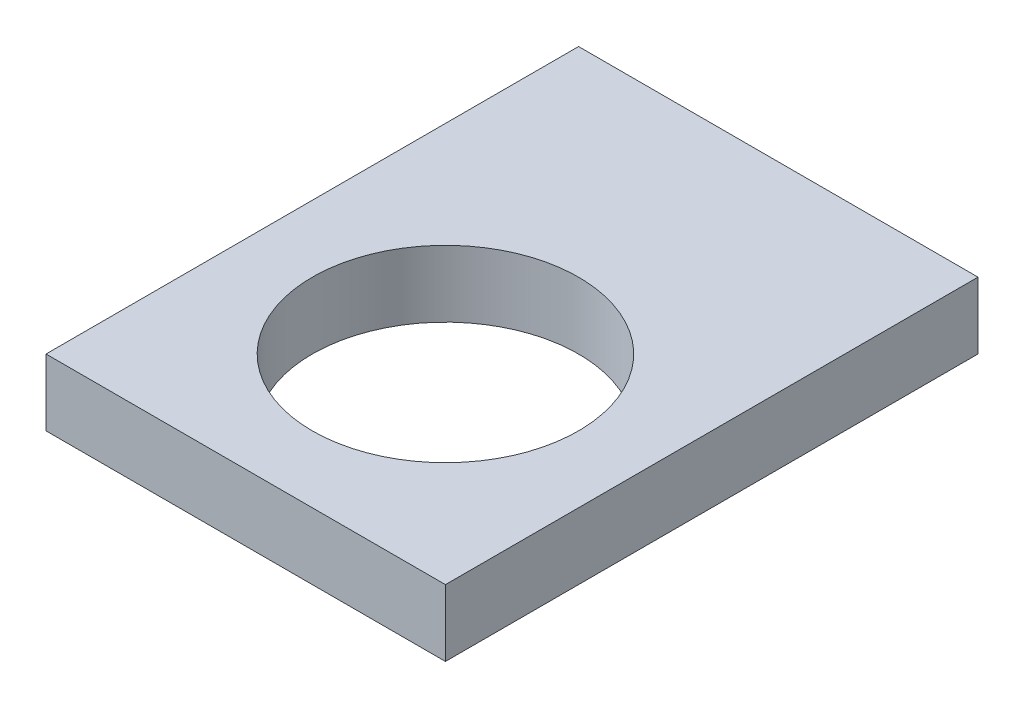
ISO-10303-21;
HEADER;
FILE_DESCRIPTION(('STEP AP214'),'2;1');
FILE_NAME('part.step','',(''),(''),'','','');
FILE_SCHEMA(('AUTOMOTIVE_DESIGN { 1 0 10303 214 1 1 1 1 }'));
ENDSEC;
DATA;
#1=APPLICATION_CONTEXT('core data for automotive mechanical design processes');
#2=APPLICATION_PROTOCOL_DEFINITION('international standard','automotive_design',2000,#1);
#3=PRODUCT_CONTEXT('',#1,'mechanical');
#4=PRODUCT('Part','Part','',(#3));
#5=PRODUCT_RELATED_PRODUCT_CATEGORY('part','',(#4));
#6=PRODUCT_DEFINITION_FORMATION('','',#4);
#7=PRODUCT_DEFINITION_CONTEXT('part definition',#1,'design');
#8=PRODUCT_DEFINITION('design','',#6,#7);
#9=PRODUCT_DEFINITION_SHAPE('','',#8);
#10=(LENGTH_UNIT() NAMED_UNIT(*) SI_UNIT(.MILLI.,.METRE.));
#11=(NAMED_UNIT(*) PLANE_ANGLE_UNIT() SI_UNIT($,.RADIAN.));
#12=(NAMED_UNIT(*) SI_UNIT($,.STERADIAN.) SOLID_ANGLE_UNIT());
#13=UNCERTAINTY_MEASURE_WITH_UNIT(LENGTH_MEASURE(1.E-05),#10,'distance_accuracy_value','');
#14=(GEOMETRIC_REPRESENTATION_CONTEXT(3) GLOBAL_UNCERTAINTY_ASSIGNED_CONTEXT((#13)) GLOBAL_UNIT_ASSIGNED_CONTEXT((#10,
#11,#12)) REPRESENTATION_CONTEXT('',''));
#15=CARTESIAN_POINT('',(0.,0.,0.));
#16=DIRECTION('',(0.,0.,1.));
#17=DIRECTION('',(1.,0.,0.));
#18=AXIS2_PLACEMENT_3D('',#15,#16,#17);
#19=CARTESIAN_POINT('',(0.,5.,20.));
#20=DIRECTION('',(0.,0.,-1.));
#21=DIRECTION('',(-1.,0.,0.));
#22=AXIS2_PLACEMENT_3D('',#19,#20,#21);
#23=PLANE('',#22);
#24=DIRECTION('',(1.,0.,0.));
#25=VECTOR('',#24,1.);
#26=CARTESIAN_POINT('',(0.,0.,20.));
#27=LINE('',#26,#25);
#28=CARTESIAN_POINT('',(-15.,0.,20.));
#29=VERTEX_POINT('',#28);
#30=CARTESIAN_POINT('',(15.,0.,20.));
#31=VERTEX_POINT('',#30);
#32=EDGE_CURVE('E98',#29,#31,#27,.T.);
#33=ORIENTED_EDGE('',*,*,#32,.T.);
#34=DIRECTION('',(0.,-1.,0.));
#35=VECTOR('',#34,1.);
#36=CARTESIAN_POINT('',(15.,5.,20.));
#37=LINE('',#36,#35);
#38=CARTESIAN_POINT('',(15.,5.,20.));
#39=VERTEX_POINT('',#38);
#40=EDGE_CURVE('E11',#39,#31,#37,.T.);
#41=ORIENTED_EDGE('',*,*,#40,.F.);
#42=DIRECTION('',(1.,0.,0.));
#43=VECTOR('',#42,1.);
#44=CARTESIAN_POINT('',(0.,5.,20.));
#45=LINE('',#44,#43);
#46=CARTESIAN_POINT('',(-15.,5.,20.));
#47=VERTEX_POINT('',#46);
#48=EDGE_CURVE('E84',#47,#39,#45,.T.);
#49=ORIENTED_EDGE('',*,*,#48,.F.);
#50=DIRECTION('',(0.,-1.,0.));
#51=VECTOR('',#50,1.);
#52=CARTESIAN_POINT('',(-15.,5.,20.));
#53=LINE('',#52,#51);
#54=EDGE_CURVE('E51',#47,#29,#53,.T.);
#55=ORIENTED_EDGE('',*,*,#54,.T.);
#56=EDGE_LOOP('',(#33,#41,#49,#55));
#57=FACE_BOUND('',#56,.T.);
#58=ADVANCED_FACE('F35',(#57),#23,.F.);
#59=CARTESIAN_POINT('',(15.,5.,0.));
#60=DIRECTION('',(-1.,0.,0.));
#61=DIRECTION('',(0.,0.,1.));
#62=AXIS2_PLACEMENT_3D('',#59,#60,#61);
#63=PLANE('',#62);
#64=DIRECTION('',(0.,0.,-1.));
#65=VECTOR('',#64,1.);
#66=CARTESIAN_POINT('',(15.,0.,0.));
#67=LINE('',#66,#65);
#68=CARTESIAN_POINT('',(15.,0.,-20.));
#69=VERTEX_POINT('',#68);
#70=EDGE_CURVE('E89',#31,#69,#67,.T.);
#71=ORIENTED_EDGE('',*,*,#70,.T.);
#72=DIRECTION('',(0.,-1.,0.));
#73=VECTOR('',#72,1.);
#74=CARTESIAN_POINT('',(15.,5.,-20.));
#75=LINE('',#74,#73);
#76=CARTESIAN_POINT('',(15.,5.,-20.));
#77=VERTEX_POINT('',#76);
#78=EDGE_CURVE('E43',#77,#69,#75,.T.);
#79=ORIENTED_EDGE('',*,*,#78,.F.);
#80=DIRECTION('',(0.,0.,-1.));
#81=VECTOR('',#80,1.);
#82=CARTESIAN_POINT('',(15.,5.,0.));
#83=LINE('',#82,#81);
#84=EDGE_CURVE('E76',#39,#77,#83,.T.);
#85=ORIENTED_EDGE('',*,*,#84,.F.);
#86=ORIENTED_EDGE('',*,*,#40,.T.);
#87=EDGE_LOOP('',(#71,#79,#85,#86));
#88=FACE_BOUND('',#87,.T.);
#89=ADVANCED_FACE('F88',(#88),#63,.F.);
#90=CARTESIAN_POINT('',(0.,5.,-20.));
#91=DIRECTION('',(0.,0.,-1.));
#92=DIRECTION('',(-1.,0.,0.));
#93=AXIS2_PLACEMENT_3D('',#90,#91,#92);
#94=PLANE('',#93);
#95=DIRECTION('',(1.,0.,0.));
#96=VECTOR('',#95,1.);
#97=CARTESIAN_POINT('',(0.,0.,-20.));
#98=LINE('',#97,#96);
#99=CARTESIAN_POINT('',(-15.,0.,-20.));
#100=VERTEX_POINT('',#99);
#101=EDGE_CURVE('E102',#100,#69,#98,.T.);
#102=ORIENTED_EDGE('',*,*,#101,.F.);
#103=DIRECTION('',(0.,-1.,0.));
#104=VECTOR('',#103,1.);
#105=CARTESIAN_POINT('',(-15.,5.,-20.));
#106=LINE('',#105,#104);
#107=CARTESIAN_POINT('',(-15.,5.,-20.));
#108=VERTEX_POINT('',#107);
#109=EDGE_CURVE('E65',#108,#100,#106,.T.);
#110=ORIENTED_EDGE('',*,*,#109,.F.);
#111=DIRECTION('',(1.,0.,0.));
#112=VECTOR('',#111,1.);
#113=CARTESIAN_POINT('',(0.,5.,-20.));
#114=LINE('',#113,#112);
#115=EDGE_CURVE('E83',#108,#77,#114,.T.);
#116=ORIENTED_EDGE('',*,*,#115,.T.);
#117=ORIENTED_EDGE('',*,*,#78,.T.);
#118=EDGE_LOOP('',(#102,#110,#116,#117));
#119=FACE_BOUND('',#118,.T.);
#120=ADVANCED_FACE('F92',(#119),#94,.T.);
#121=CARTESIAN_POINT('',(-15.,5.,0.));
#122=DIRECTION('',(-1.,0.,0.));
#123=DIRECTION('',(0.,0.,1.));
#124=AXIS2_PLACEMENT_3D('',#121,#122,#123);
#125=PLANE('',#124);
#126=DIRECTION('',(0.,0.,-1.));
#127=VECTOR('',#126,1.);
#128=CARTESIAN_POINT('',(-15.,0.,0.));
#129=LINE('',#128,#127);
#130=EDGE_CURVE('E104',#29,#100,#129,.T.);
#131=ORIENTED_EDGE('',*,*,#130,.F.);
#132=ORIENTED_EDGE('',*,*,#54,.F.);
#133=DIRECTION('',(0.,0.,-1.));
#134=VECTOR('',#133,1.);
#135=CARTESIAN_POINT('',(-15.,5.,0.));
#136=LINE('',#135,#134);
#137=EDGE_CURVE('E93',#47,#108,#136,.T.);
#138=ORIENTED_EDGE('',*,*,#137,.T.);
#139=ORIENTED_EDGE('',*,*,#109,.T.);
#140=EDGE_LOOP('',(#131,#132,#138,#139));
#141=FACE_BOUND('',#140,.T.);
#142=ADVANCED_FACE('F125',(#141),#125,.T.);
#143=CARTESIAN_POINT('',(0.,5.,0.));
#144=DIRECTION('',(0.,1.,0.));
#145=DIRECTION('',(0.,0.,1.));
#146=AXIS2_PLACEMENT_3D('',#143,#144,#145);
#147=PLANE('',#146);
#148=CARTESIAN_POINT('',(0.,5.,5.));
#149=DIRECTION('',(0.,1.,0.));
#150=DIRECTION('',(0.,0.,1.));
#151=AXIS2_PLACEMENT_3D('',#148,#149,#150);
#152=CIRCLE('',#151,10.);
#153=CARTESIAN_POINT('',(0.,5.,15.));
#154=VERTEX_POINT('',#153);
#155=EDGE_CURVE('E110',#154,#154,#152,.T.);
#156=ORIENTED_EDGE('',*,*,#155,.F.);
#157=EDGE_LOOP('',(#156));
#158=FACE_BOUND('',#157,.T.);
#159=ORIENTED_EDGE('',*,*,#48,.T.);
#160=ORIENTED_EDGE('',*,*,#84,.T.);
#161=ORIENTED_EDGE('',*,*,#115,.F.);
#162=ORIENTED_EDGE('',*,*,#137,.F.);
#163=EDGE_LOOP('',(#159,#160,#161,#162));
#164=FACE_BOUND('',#163,.T.);
#165=ADVANCED_FACE('F80',(#158,#164),#147,.T.);
#166=CARTESIAN_POINT('',(0.,0.,0.));
#167=DIRECTION('',(0.,1.,0.));
#168=DIRECTION('',(0.,0.,1.));
#169=AXIS2_PLACEMENT_3D('',#166,#167,#168);
#170=PLANE('',#169);
#171=CARTESIAN_POINT('',(0.,0.,5.));
#172=DIRECTION('',(0.,1.,0.));
#173=DIRECTION('',(0.,0.,1.));
#174=AXIS2_PLACEMENT_3D('',#171,#172,#173);
#175=CIRCLE('',#174,10.);
#176=CARTESIAN_POINT('',(0.,0.,15.));
#177=VERTEX_POINT('',#176);
#178=EDGE_CURVE('E100',#177,#177,#175,.T.);
#179=ORIENTED_EDGE('',*,*,#178,.T.);
#180=EDGE_LOOP('',(#179));
#181=FACE_BOUND('',#180,.T.);
#182=ORIENTED_EDGE('',*,*,#32,.F.);
#183=ORIENTED_EDGE('',*,*,#130,.T.);
#184=ORIENTED_EDGE('',*,*,#101,.T.);
#185=ORIENTED_EDGE('',*,*,#70,.F.);
#186=EDGE_LOOP('',(#182,#183,#184,#185));
#187=FACE_BOUND('',#186,.T.);
#188=ADVANCED_FACE('F116',(#181,#187),#170,.F.);
#189=CARTESIAN_POINT('',(0.,0.,5.));
#190=DIRECTION('',(0.,1.,0.));
#191=DIRECTION('',(0.,0.,1.));
#192=AXIS2_PLACEMENT_3D('',#189,#190,#191);
#193=CYLINDRICAL_SURFACE('',#192,10.);
#194=ORIENTED_EDGE('',*,*,#178,.F.);
#195=EDGE_LOOP('',(#194));
#196=FACE_BOUND('',#195,.T.);
#197=ORIENTED_EDGE('',*,*,#155,.T.);
#198=EDGE_LOOP('',(#197));
#199=FACE_BOUND('',#198,.T.);
#200=ADVANCED_FACE('F118',(#196,#199),#193,.F.);
#201=CLOSED_SHELL('',(#58,#89,#120,#142,#165,#188,#200));
#202=MANIFOLD_SOLID_BREP('B2',#201);
#203=ADVANCED_BREP_SHAPE_REPRESENTATION('',(#18,#202),#14);
#204=SHAPE_DEFINITION_REPRESENTATION(#9,#203);
ENDSEC;
END-ISO-10303-21;
